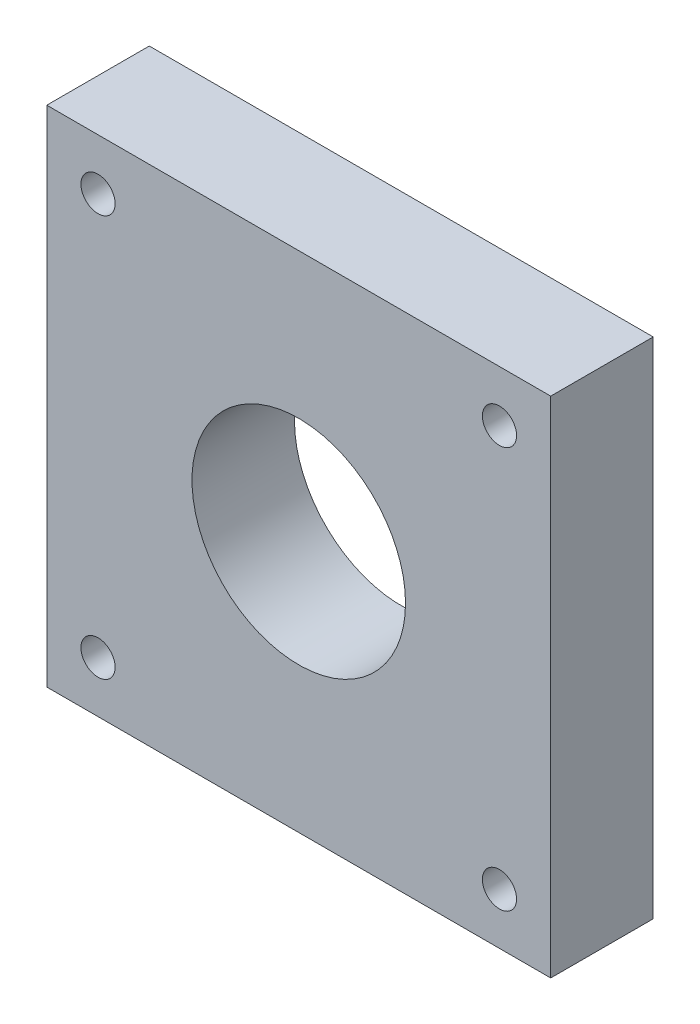
ISO-10303-21;
HEADER;
FILE_DESCRIPTION(('STEP AP214'),'2;1');
FILE_NAME('part.step','',(''),(''),'','','');
FILE_SCHEMA(('AUTOMOTIVE_DESIGN { 1 0 10303 214 1 1 1 1 }'));
ENDSEC;
DATA;
#1=APPLICATION_CONTEXT('core data for automotive mechanical design processes');
#2=APPLICATION_PROTOCOL_DEFINITION('international standard','automotive_design',2000,#1);
#3=PRODUCT_CONTEXT('',#1,'mechanical');
#4=PRODUCT('Part','Part','',(#3));
#5=PRODUCT_RELATED_PRODUCT_CATEGORY('part','',(#4));
#6=PRODUCT_DEFINITION_FORMATION('','',#4);
#7=PRODUCT_DEFINITION_CONTEXT('part definition',#1,'design');
#8=PRODUCT_DEFINITION('design','',#6,#7);
#9=PRODUCT_DEFINITION_SHAPE('','',#8);
#10=(LENGTH_UNIT() NAMED_UNIT(*) SI_UNIT(.MILLI.,.METRE.));
#11=(NAMED_UNIT(*) PLANE_ANGLE_UNIT() SI_UNIT($,.RADIAN.));
#12=(NAMED_UNIT(*) SI_UNIT($,.STERADIAN.) SOLID_ANGLE_UNIT());
#13=UNCERTAINTY_MEASURE_WITH_UNIT(LENGTH_MEASURE(1.E-05),#10,'distance_accuracy_value','');
#14=(GEOMETRIC_REPRESENTATION_CONTEXT(3) GLOBAL_UNCERTAINTY_ASSIGNED_CONTEXT((#13)) GLOBAL_UNIT_ASSIGNED_CONTEXT((#10,
#11,#12)) REPRESENTATION_CONTEXT('',''));
#15=CARTESIAN_POINT('',(0.,0.,0.));
#16=DIRECTION('',(0.,0.,1.));
#17=DIRECTION('',(1.,0.,0.));
#18=AXIS2_PLACEMENT_3D('',#15,#16,#17);
#19=CARTESIAN_POINT('',(29.5,29.5,12.));
#20=DIRECTION('',(0.,0.,-1.));
#21=DIRECTION('',(-1.,0.,0.));
#22=AXIS2_PLACEMENT_3D('',#19,#20,#21);
#23=PLANE('',#22);
#24=CARTESIAN_POINT('',(0.,0.,12.));
#25=DIRECTION('',(0.,0.,1.));
#26=DIRECTION('',(1.,0.,0.));
#27=AXIS2_PLACEMENT_3D('',#24,#25,#26);
#28=CIRCLE('',#27,12.5);
#29=CARTESIAN_POINT('',(12.5,0.,12.));
#30=VERTEX_POINT('',#29);
#31=EDGE_CURVE('E131',#30,#30,#28,.T.);
#32=ORIENTED_EDGE('',*,*,#31,.F.);
#33=EDGE_LOOP('',(#32));
#34=FACE_BOUND('',#33,.T.);
#35=CARTESIAN_POINT('',(23.5,-23.5,12.));
#36=DIRECTION('',(0.,0.,1.));
#37=DIRECTION('',(-1.,0.,0.));
#38=AXIS2_PLACEMENT_3D('',#35,#36,#37);
#39=CIRCLE('',#38,2.);
#40=CARTESIAN_POINT('',(21.5,-23.5,12.));
#41=VERTEX_POINT('',#40);
#42=EDGE_CURVE('E127',#41,#41,#39,.T.);
#43=ORIENTED_EDGE('',*,*,#42,.F.);
#44=EDGE_LOOP('',(#43));
#45=FACE_BOUND('',#44,.T.);
#46=CARTESIAN_POINT('',(23.5,23.5,12.));
#47=DIRECTION('',(0.,0.,-1.));
#48=DIRECTION('',(-1.,0.,0.));
#49=AXIS2_PLACEMENT_3D('',#46,#47,#48);
#50=CIRCLE('',#49,2.);
#51=CARTESIAN_POINT('',(21.5,23.5,12.));
#52=VERTEX_POINT('',#51);
#53=EDGE_CURVE('E118',#52,#52,#50,.T.);
#54=ORIENTED_EDGE('',*,*,#53,.T.);
#55=EDGE_LOOP('',(#54));
#56=FACE_BOUND('',#55,.T.);
#57=CARTESIAN_POINT('',(-23.5,23.5,12.));
#58=DIRECTION('',(0.,0.,1.));
#59=DIRECTION('',(1.,0.,0.));
#60=AXIS2_PLACEMENT_3D('',#57,#58,#59);
#61=CIRCLE('',#60,2.);
#62=CARTESIAN_POINT('',(-21.5,23.5,12.));
#63=VERTEX_POINT('',#62);
#64=EDGE_CURVE('E98',#63,#63,#61,.T.);
#65=ORIENTED_EDGE('',*,*,#64,.F.);
#66=EDGE_LOOP('',(#65));
#67=FACE_BOUND('',#66,.T.);
#68=DIRECTION('',(0.,1.,0.));
#69=VECTOR('',#68,1.);
#70=CARTESIAN_POINT('',(29.5,-29.5,12.));
#71=LINE('',#70,#69);
#72=CARTESIAN_POINT('',(29.5,-29.5,12.));
#73=VERTEX_POINT('',#72);
#74=CARTESIAN_POINT('',(29.5,29.5,12.));
#75=VERTEX_POINT('',#74);
#76=EDGE_CURVE('E83',#73,#75,#71,.T.);
#77=ORIENTED_EDGE('',*,*,#76,.T.);
#78=DIRECTION('',(-1.,0.,0.));
#79=VECTOR('',#78,1.);
#80=CARTESIAN_POINT('',(-29.5,29.5,12.));
#81=LINE('',#80,#79);
#82=CARTESIAN_POINT('',(-29.5,29.5,12.));
#83=VERTEX_POINT('',#82);
#84=EDGE_CURVE('E78',#75,#83,#81,.T.);
#85=ORIENTED_EDGE('',*,*,#84,.T.);
#86=DIRECTION('',(0.,-1.,0.));
#87=VECTOR('',#86,1.);
#88=CARTESIAN_POINT('',(-29.5,-29.5,12.));
#89=LINE('',#88,#87);
#90=CARTESIAN_POINT('',(-29.5,-29.5,12.));
#91=VERTEX_POINT('',#90);
#92=EDGE_CURVE('E81',#83,#91,#89,.T.);
#93=ORIENTED_EDGE('',*,*,#92,.T.);
#94=DIRECTION('',(1.,0.,0.));
#95=VECTOR('',#94,1.);
#96=CARTESIAN_POINT('',(-29.5,-29.5,12.));
#97=LINE('',#96,#95);
#98=EDGE_CURVE('E48',#91,#73,#97,.T.);
#99=ORIENTED_EDGE('',*,*,#98,.T.);
#100=EDGE_LOOP('',(#77,#85,#93,#99));
#101=FACE_BOUND('',#100,.T.);
#102=CARTESIAN_POINT('',(-23.5,-23.5,12.));
#103=DIRECTION('',(0.,0.,-1.));
#104=DIRECTION('',(1.,0.,0.));
#105=AXIS2_PLACEMENT_3D('',#102,#103,#104);
#106=CIRCLE('',#105,2.);
#107=CARTESIAN_POINT('',(-21.5,-23.5,12.));
#108=VERTEX_POINT('',#107);
#109=EDGE_CURVE('E124',#108,#108,#106,.T.);
#110=ORIENTED_EDGE('',*,*,#109,.T.);
#111=EDGE_LOOP('',(#110));
#112=FACE_BOUND('',#111,.T.);
#113=ADVANCED_FACE('F31',(#34,#45,#56,#67,#101,#112),#23,.F.);
#114=CARTESIAN_POINT('',(29.5,29.5,0.));
#115=DIRECTION('',(0.,0.,-1.));
#116=DIRECTION('',(-1.,0.,0.));
#117=AXIS2_PLACEMENT_3D('',#114,#115,#116);
#118=PLANE('',#117);
#119=CARTESIAN_POINT('',(0.,0.,0.));
#120=DIRECTION('',(0.,0.,-1.));
#121=DIRECTION('',(-1.,0.,0.));
#122=AXIS2_PLACEMENT_3D('',#119,#120,#121);
#123=CIRCLE('',#122,12.5);
#124=CARTESIAN_POINT('',(-12.5,0.,0.));
#125=VERTEX_POINT('',#124);
#126=EDGE_CURVE('E134',#125,#125,#123,.F.);
#127=ORIENTED_EDGE('',*,*,#126,.T.);
#128=EDGE_LOOP('',(#127));
#129=FACE_BOUND('',#128,.T.);
#130=CARTESIAN_POINT('',(23.5,-23.5,0.));
#131=DIRECTION('',(0.,0.,-1.));
#132=DIRECTION('',(-1.,0.,0.));
#133=AXIS2_PLACEMENT_3D('',#130,#131,#132);
#134=CIRCLE('',#133,2.);
#135=CARTESIAN_POINT('',(21.5,-23.5,0.));
#136=VERTEX_POINT('',#135);
#137=EDGE_CURVE('E128',#136,#136,#134,.F.);
#138=ORIENTED_EDGE('',*,*,#137,.T.);
#139=EDGE_LOOP('',(#138));
#140=FACE_BOUND('',#139,.T.);
#141=CARTESIAN_POINT('',(23.5,23.5,0.));
#142=DIRECTION('',(0.,0.,-1.));
#143=DIRECTION('',(-1.,0.,0.));
#144=AXIS2_PLACEMENT_3D('',#141,#142,#143);
#145=CIRCLE('',#144,2.);
#146=CARTESIAN_POINT('',(21.5,23.5,0.));
#147=VERTEX_POINT('',#146);
#148=EDGE_CURVE('E113',#147,#147,#145,.T.);
#149=ORIENTED_EDGE('',*,*,#148,.F.);
#150=EDGE_LOOP('',(#149));
#151=FACE_BOUND('',#150,.T.);
#152=CARTESIAN_POINT('',(-23.5,23.5,0.));
#153=DIRECTION('',(0.,0.,-1.));
#154=DIRECTION('',(-1.,0.,0.));
#155=AXIS2_PLACEMENT_3D('',#152,#153,#154);
#156=CIRCLE('',#155,2.);
#157=CARTESIAN_POINT('',(-25.5,23.5,0.));
#158=VERTEX_POINT('',#157);
#159=EDGE_CURVE('E110',#158,#158,#156,.F.);
#160=ORIENTED_EDGE('',*,*,#159,.T.);
#161=EDGE_LOOP('',(#160));
#162=FACE_BOUND('',#161,.T.);
#163=DIRECTION('',(0.,1.,0.));
#164=VECTOR('',#163,1.);
#165=CARTESIAN_POINT('',(29.5,-29.5,0.));
#166=LINE('',#165,#164);
#167=CARTESIAN_POINT('',(29.5,-29.5,0.));
#168=VERTEX_POINT('',#167);
#169=CARTESIAN_POINT('',(29.5,29.5,0.));
#170=VERTEX_POINT('',#169);
#171=EDGE_CURVE('E95',#168,#170,#166,.T.);
#172=ORIENTED_EDGE('',*,*,#171,.F.);
#173=DIRECTION('',(1.,0.,0.));
#174=VECTOR('',#173,1.);
#175=CARTESIAN_POINT('',(-29.5,-29.5,0.));
#176=LINE('',#175,#174);
#177=CARTESIAN_POINT('',(-29.5,-29.5,0.));
#178=VERTEX_POINT('',#177);
#179=EDGE_CURVE('E71',#178,#168,#176,.T.);
#180=ORIENTED_EDGE('',*,*,#179,.F.);
#181=DIRECTION('',(0.,-1.,0.));
#182=VECTOR('',#181,1.);
#183=CARTESIAN_POINT('',(-29.5,-29.5,0.));
#184=LINE('',#183,#182);
#185=CARTESIAN_POINT('',(-29.5,29.5,0.));
#186=VERTEX_POINT('',#185);
#187=EDGE_CURVE('E65',#186,#178,#184,.T.);
#188=ORIENTED_EDGE('',*,*,#187,.F.);
#189=DIRECTION('',(-1.,0.,0.));
#190=VECTOR('',#189,1.);
#191=CARTESIAN_POINT('',(-29.5,29.5,0.));
#192=LINE('',#191,#190);
#193=EDGE_CURVE('E87',#170,#186,#192,.T.);
#194=ORIENTED_EDGE('',*,*,#193,.F.);
#195=EDGE_LOOP('',(#172,#180,#188,#194));
#196=FACE_BOUND('',#195,.T.);
#197=CARTESIAN_POINT('',(-23.5,-23.5,0.));
#198=DIRECTION('',(0.,0.,-1.));
#199=DIRECTION('',(-1.,0.,0.));
#200=AXIS2_PLACEMENT_3D('',#197,#198,#199);
#201=CIRCLE('',#200,2.);
#202=CARTESIAN_POINT('',(-25.5,-23.5,0.));
#203=VERTEX_POINT('',#202);
#204=EDGE_CURVE('E121',#203,#203,#201,.T.);
#205=ORIENTED_EDGE('',*,*,#204,.F.);
#206=EDGE_LOOP('',(#205));
#207=FACE_BOUND('',#206,.T.);
#208=ADVANCED_FACE('F106',(#129,#140,#151,#162,#196,#207),#118,.T.);
#209=CARTESIAN_POINT('',(29.5,-29.5,12.));
#210=DIRECTION('',(-1.,0.,0.));
#211=DIRECTION('',(0.,0.,1.));
#212=AXIS2_PLACEMENT_3D('',#209,#210,#211);
#213=PLANE('',#212);
#214=ORIENTED_EDGE('',*,*,#171,.T.);
#215=DIRECTION('',(0.,0.,-1.));
#216=VECTOR('',#215,1.);
#217=CARTESIAN_POINT('',(29.5,29.5,12.));
#218=LINE('',#217,#216);
#219=EDGE_CURVE('E11',#75,#170,#218,.T.);
#220=ORIENTED_EDGE('',*,*,#219,.F.);
#221=ORIENTED_EDGE('',*,*,#76,.F.);
#222=DIRECTION('',(0.,0.,-1.));
#223=VECTOR('',#222,1.);
#224=CARTESIAN_POINT('',(29.5,-29.5,12.));
#225=LINE('',#224,#223);
#226=EDGE_CURVE('E91',#73,#168,#225,.T.);
#227=ORIENTED_EDGE('',*,*,#226,.T.);
#228=EDGE_LOOP('',(#214,#220,#221,#227));
#229=FACE_BOUND('',#228,.T.);
#230=ADVANCED_FACE('F33',(#229),#213,.F.);
#231=CARTESIAN_POINT('',(-29.5,29.5,12.));
#232=DIRECTION('',(0.,-1.,0.));
#233=DIRECTION('',(0.,0.,-1.));
#234=AXIS2_PLACEMENT_3D('',#231,#232,#233);
#235=PLANE('',#234);
#236=ORIENTED_EDGE('',*,*,#193,.T.);
#237=DIRECTION('',(0.,0.,-1.));
#238=VECTOR('',#237,1.);
#239=CARTESIAN_POINT('',(-29.5,29.5,12.));
#240=LINE('',#239,#238);
#241=EDGE_CURVE('E40',#83,#186,#240,.T.);
#242=ORIENTED_EDGE('',*,*,#241,.F.);
#243=ORIENTED_EDGE('',*,*,#84,.F.);
#244=ORIENTED_EDGE('',*,*,#219,.T.);
#245=EDGE_LOOP('',(#236,#242,#243,#244));
#246=FACE_BOUND('',#245,.T.);
#247=ADVANCED_FACE('F86',(#246),#235,.F.);
#248=CARTESIAN_POINT('',(-29.5,-29.5,12.));
#249=DIRECTION('',(1.,0.,0.));
#250=DIRECTION('',(0.,0.,-1.));
#251=AXIS2_PLACEMENT_3D('',#248,#249,#250);
#252=PLANE('',#251);
#253=ORIENTED_EDGE('',*,*,#187,.T.);
#254=DIRECTION('',(0.,0.,-1.));
#255=VECTOR('',#254,1.);
#256=CARTESIAN_POINT('',(-29.5,-29.5,12.));
#257=LINE('',#256,#255);
#258=EDGE_CURVE('E88',#91,#178,#257,.T.);
#259=ORIENTED_EDGE('',*,*,#258,.F.);
#260=ORIENTED_EDGE('',*,*,#92,.F.);
#261=ORIENTED_EDGE('',*,*,#241,.T.);
#262=EDGE_LOOP('',(#253,#259,#260,#261));
#263=FACE_BOUND('',#262,.T.);
#264=ADVANCED_FACE('F89',(#263),#252,.F.);
#265=CARTESIAN_POINT('',(-29.5,-29.5,12.));
#266=DIRECTION('',(0.,1.,0.));
#267=DIRECTION('',(0.,0.,1.));
#268=AXIS2_PLACEMENT_3D('',#265,#266,#267);
#269=PLANE('',#268);
#270=ORIENTED_EDGE('',*,*,#179,.T.);
#271=ORIENTED_EDGE('',*,*,#226,.F.);
#272=ORIENTED_EDGE('',*,*,#98,.F.);
#273=ORIENTED_EDGE('',*,*,#258,.T.);
#274=EDGE_LOOP('',(#270,#271,#272,#273));
#275=FACE_BOUND('',#274,.T.);
#276=ADVANCED_FACE('F103',(#275),#269,.F.);
#277=CARTESIAN_POINT('',(-23.5,23.5,-0.000999999999999265));
#278=DIRECTION('',(0.,0.,1.));
#279=DIRECTION('',(1.,0.,0.));
#280=AXIS2_PLACEMENT_3D('',#277,#278,#279);
#281=CYLINDRICAL_SURFACE('',#280,2.);
#282=ORIENTED_EDGE('',*,*,#159,.F.);
#283=EDGE_LOOP('',(#282));
#284=FACE_BOUND('',#283,.T.);
#285=ORIENTED_EDGE('',*,*,#64,.T.);
#286=EDGE_LOOP('',(#285));
#287=FACE_BOUND('',#286,.T.);
#288=ADVANCED_FACE('F151',(#284,#287),#281,.F.);
#289=CARTESIAN_POINT('',(23.5,23.5,-0.000999999999999265));
#290=DIRECTION('',(0.,0.,1.));
#291=DIRECTION('',(1.,0.,0.));
#292=AXIS2_PLACEMENT_3D('',#289,#290,#291);
#293=CYLINDRICAL_SURFACE('',#292,2.);
#294=ORIENTED_EDGE('',*,*,#148,.T.);
#295=EDGE_LOOP('',(#294));
#296=FACE_BOUND('',#295,.T.);
#297=ORIENTED_EDGE('',*,*,#53,.F.);
#298=EDGE_LOOP('',(#297));
#299=FACE_BOUND('',#298,.T.);
#300=ADVANCED_FACE('F153',(#296,#299),#293,.F.);
#301=CARTESIAN_POINT('',(-23.5,-23.5,-0.000999999999999265));
#302=DIRECTION('',(0.,0.,1.));
#303=DIRECTION('',(1.,0.,0.));
#304=AXIS2_PLACEMENT_3D('',#301,#302,#303);
#305=CYLINDRICAL_SURFACE('',#304,2.);
#306=ORIENTED_EDGE('',*,*,#204,.T.);
#307=EDGE_LOOP('',(#306));
#308=FACE_BOUND('',#307,.T.);
#309=ORIENTED_EDGE('',*,*,#109,.F.);
#310=EDGE_LOOP('',(#309));
#311=FACE_BOUND('',#310,.T.);
#312=ADVANCED_FACE('F160',(#308,#311),#305,.F.);
#313=CARTESIAN_POINT('',(23.5,-23.5,-0.000999999999999265));
#314=DIRECTION('',(0.,0.,1.));
#315=DIRECTION('',(1.,0.,0.));
#316=AXIS2_PLACEMENT_3D('',#313,#314,#315);
#317=CYLINDRICAL_SURFACE('',#316,2.);
#318=ORIENTED_EDGE('',*,*,#137,.F.);
#319=EDGE_LOOP('',(#318));
#320=FACE_BOUND('',#319,.T.);
#321=ORIENTED_EDGE('',*,*,#42,.T.);
#322=EDGE_LOOP('',(#321));
#323=FACE_BOUND('',#322,.T.);
#324=ADVANCED_FACE('F192',(#320,#323),#317,.F.);
#325=CARTESIAN_POINT('',(0.,0.,-0.000999999999999265));
#326=DIRECTION('',(0.,0.,1.));
#327=DIRECTION('',(1.,0.,0.));
#328=AXIS2_PLACEMENT_3D('',#325,#326,#327);
#329=CYLINDRICAL_SURFACE('',#328,12.5);
#330=ORIENTED_EDGE('',*,*,#126,.F.);
#331=EDGE_LOOP('',(#330));
#332=FACE_BOUND('',#331,.T.);
#333=ORIENTED_EDGE('',*,*,#31,.T.);
#334=EDGE_LOOP('',(#333));
#335=FACE_BOUND('',#334,.T.);
#336=ADVANCED_FACE('F140',(#332,#335),#329,.F.);
#337=CLOSED_SHELL('',(#113,#208,#230,#247,#264,#276,#288,#300,#312,#324,#336));
#338=MANIFOLD_SOLID_BREP('B2',#337);
#339=ADVANCED_BREP_SHAPE_REPRESENTATION('',(#18,#338),#14);
#340=SHAPE_DEFINITION_REPRESENTATION(#9,#339);
ENDSEC;
END-ISO-10303-21;
